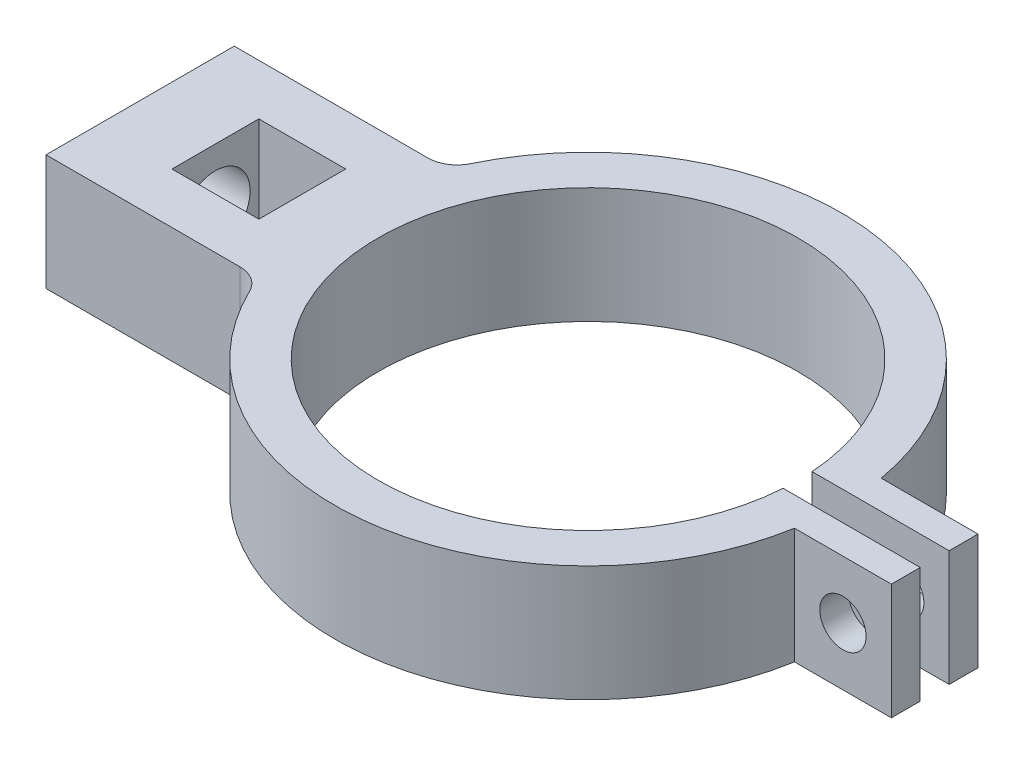
ISO-10303-21;
HEADER;
FILE_DESCRIPTION(('STEP AP214'),'2;1');
FILE_NAME('part.step','',(''),(''),'','','');
FILE_SCHEMA(('AUTOMOTIVE_DESIGN { 1 0 10303 214 1 1 1 1 }'));
ENDSEC;
DATA;
#1=APPLICATION_CONTEXT('core data for automotive mechanical design processes');
#2=APPLICATION_PROTOCOL_DEFINITION('international standard','automotive_design',2000,#1);
#3=PRODUCT_CONTEXT('',#1,'mechanical');
#4=PRODUCT('Part','Part','',(#3));
#5=PRODUCT_RELATED_PRODUCT_CATEGORY('part','',(#4));
#6=PRODUCT_DEFINITION_FORMATION('','',#4);
#7=PRODUCT_DEFINITION_CONTEXT('part definition',#1,'design');
#8=PRODUCT_DEFINITION('design','',#6,#7);
#9=PRODUCT_DEFINITION_SHAPE('','',#8);
#10=(LENGTH_UNIT() NAMED_UNIT(*) SI_UNIT(.MILLI.,.METRE.));
#11=(NAMED_UNIT(*) PLANE_ANGLE_UNIT() SI_UNIT($,.RADIAN.));
#12=(NAMED_UNIT(*) SI_UNIT($,.STERADIAN.) SOLID_ANGLE_UNIT());
#13=UNCERTAINTY_MEASURE_WITH_UNIT(LENGTH_MEASURE(1.E-05),#10,'distance_accuracy_value','');
#14=(GEOMETRIC_REPRESENTATION_CONTEXT(3) GLOBAL_UNCERTAINTY_ASSIGNED_CONTEXT((#13)) GLOBAL_UNIT_ASSIGNED_CONTEXT((#10,
#11,#12)) REPRESENTATION_CONTEXT('',''));
#15=CARTESIAN_POINT('',(0.,0.,0.));
#16=DIRECTION('',(0.,0.,1.));
#17=DIRECTION('',(1.,0.,0.));
#18=AXIS2_PLACEMENT_3D('',#15,#16,#17);
#19=CARTESIAN_POINT('',(0.,10.16,0.));
#20=DIRECTION('',(0.,1.,0.));
#21=DIRECTION('',(0.,0.,1.));
#22=AXIS2_PLACEMENT_3D('',#19,#20,#21);
#23=PLANE('',#22);
#24=DIRECTION('',(1.,0.,0.));
#25=VECTOR('',#24,1.);
#26=CARTESIAN_POINT('',(-20.6350575477753,10.16,8.255));
#27=LINE('',#26,#25);
#28=CARTESIAN_POINT('',(-39.2920360483371,10.16,8.255));
#29=VERTEX_POINT('',#28);
#30=CARTESIAN_POINT('',(-22.288409543976,10.16,8.255));
#31=VERTEX_POINT('',#30);
#32=EDGE_CURVE('E227',#29,#31,#27,.T.);
#33=ORIENTED_EDGE('',*,*,#32,.T.);
#34=CARTESIAN_POINT('',(-22.288409543976,10.16,10.795));
#35=DIRECTION('',(0.,1.,0.));
#36=DIRECTION('',(0.,0.,1.));
#37=AXIS2_PLACEMENT_3D('',#34,#35,#36);
#38=CIRCLE('',#37,2.54);
#39=CARTESIAN_POINT('',(-20.0024188215169,10.16,9.68782051282052));
#40=VERTEX_POINT('',#39);
#41=EDGE_CURVE('E11',#31,#40,#38,.F.);
#42=ORIENTED_EDGE('',*,*,#41,.T.);
#43=CARTESIAN_POINT('',(0.,10.16,0.));
#44=DIRECTION('',(0.,1.,0.));
#45=DIRECTION('',(0.,0.,1.));
#46=AXIS2_PLACEMENT_3D('',#43,#44,#45);
#47=CIRCLE('',#46,22.225);
#48=CARTESIAN_POINT('',(21.8990733162336,10.16,3.79225696521527));
#49=VERTEX_POINT('',#48);
#50=EDGE_CURVE('E203',#40,#49,#47,.T.);
#51=ORIENTED_EDGE('',*,*,#50,.T.);
#52=DIRECTION('',(1.,0.,0.));
#53=VECTOR('',#52,1.);
#54=CARTESIAN_POINT('',(21.8990733162336,10.16,3.79225696521527));
#55=LINE('',#54,#53);
#56=CARTESIAN_POINT('',(30.3942159406479,10.16,3.79225696521527));
#57=VERTEX_POINT('',#56);
#58=EDGE_CURVE('E205',#49,#57,#55,.T.);
#59=ORIENTED_EDGE('',*,*,#58,.T.);
#60=DIRECTION('',(0.000237053910458044,0.,-0.999999971902721));
#61=VECTOR('',#60,1.);
#62=CARTESIAN_POINT('',(30.3948159112672,10.16,1.26131115058317));
#63=LINE('',#62,#61);
#64=CARTESIAN_POINT('',(30.3948159112672,10.16,1.26131115058317));
#65=VERTEX_POINT('',#64);
#66=EDGE_CURVE('E208',#57,#65,#63,.T.);
#67=ORIENTED_EDGE('',*,*,#66,.T.);
#68=DIRECTION('',(-1.,0.,0.));
#69=VECTOR('',#68,1.);
#70=CARTESIAN_POINT('',(30.3948159112672,10.16,1.26131115058317));
#71=LINE('',#70,#69);
#72=CARTESIAN_POINT('',(18.3717532963355,10.16,1.26131115058317));
#73=VERTEX_POINT('',#72);
#74=EDGE_CURVE('E210',#65,#73,#71,.T.);
#75=ORIENTED_EDGE('',*,*,#74,.T.);
#76=CARTESIAN_POINT('',(0.,10.16,0.));
#77=DIRECTION('',(0.,-1.,0.));
#78=DIRECTION('',(0.,0.,1.));
#79=AXIS2_PLACEMENT_3D('',#76,#77,#78);
#80=CIRCLE('',#79,18.415);
#81=CARTESIAN_POINT('',(18.3705520552633,10.16,-1.27868768073392));
#82=VERTEX_POINT('',#81);
#83=EDGE_CURVE('E212',#73,#82,#80,.T.);
#84=ORIENTED_EDGE('',*,*,#83,.T.);
#85=DIRECTION('',(1.,0.,0.));
#86=VECTOR('',#85,1.);
#87=CARTESIAN_POINT('',(30.393614670195,10.16,-1.27868768073392));
#88=LINE('',#87,#86);
#89=CARTESIAN_POINT('',(30.393614670195,10.16,-1.27868768073392));
#90=VERTEX_POINT('',#89);
#91=EDGE_CURVE('E214',#82,#90,#88,.T.);
#92=ORIENTED_EDGE('',*,*,#91,.T.);
#93=DIRECTION('',(-0.000954083026600087,0.,-0.999999544862686));
#94=VECTOR('',#93,1.);
#95=CARTESIAN_POINT('',(30.3911999376842,10.16,-3.80963241455081));
#96=LINE('',#95,#94);
#97=CARTESIAN_POINT('',(30.3911999376842,10.16,-3.80963241455081));
#98=VERTEX_POINT('',#97);
#99=EDGE_CURVE('E216',#90,#98,#96,.T.);
#100=ORIENTED_EDGE('',*,*,#99,.T.);
#101=DIRECTION('',(-1.,0.,0.));
#102=VECTOR('',#101,1.);
#103=CARTESIAN_POINT('',(21.89605731327,10.16,-3.8096324145508));
#104=LINE('',#103,#102);
#105=CARTESIAN_POINT('',(21.89605731327,10.16,-3.80963241455081));
#106=VERTEX_POINT('',#105);
#107=EDGE_CURVE('E218',#98,#106,#104,.T.);
#108=ORIENTED_EDGE('',*,*,#107,.T.);
#109=CARTESIAN_POINT('',(0.,10.16,0.));
#110=DIRECTION('',(0.,1.,0.));
#111=DIRECTION('',(0.,0.,1.));
#112=AXIS2_PLACEMENT_3D('',#109,#110,#111);
#113=CIRCLE('',#112,22.225);
#114=CARTESIAN_POINT('',(-20.0024188215169,10.16,-9.68782051282052));
#115=VERTEX_POINT('',#114);
#116=EDGE_CURVE('E220',#106,#115,#113,.T.);
#117=ORIENTED_EDGE('',*,*,#116,.T.);
#118=CARTESIAN_POINT('',(-22.288409543976,10.16,-10.795));
#119=DIRECTION('',(0.,1.,0.));
#120=DIRECTION('',(0.,0.,1.));
#121=AXIS2_PLACEMENT_3D('',#118,#119,#120);
#122=CIRCLE('',#121,2.54);
#123=CARTESIAN_POINT('',(-22.288409543976,10.16,-8.255));
#124=VERTEX_POINT('',#123);
#125=EDGE_CURVE('E293',#115,#124,#122,.F.);
#126=ORIENTED_EDGE('',*,*,#125,.T.);
#127=DIRECTION('',(-1.,0.,0.));
#128=VECTOR('',#127,1.);
#129=CARTESIAN_POINT('',(-20.6350575477753,10.16,-8.255));
#130=LINE('',#129,#128);
#131=CARTESIAN_POINT('',(-39.2920360483371,10.16,-8.255));
#132=VERTEX_POINT('',#131);
#133=EDGE_CURVE('E223',#124,#132,#130,.T.);
#134=ORIENTED_EDGE('',*,*,#133,.T.);
#135=DIRECTION('',(0.,0.,1.));
#136=VECTOR('',#135,1.);
#137=CARTESIAN_POINT('',(-39.2920360483371,10.16,-8.255));
#138=LINE('',#137,#136);
#139=EDGE_CURVE('E225',#132,#29,#138,.T.);
#140=ORIENTED_EDGE('',*,*,#139,.T.);
#141=EDGE_LOOP('',(#33,#42,#51,#59,#67,#75,#84,#92,#100,#108,#117,#126,#134,#140));
#142=FACE_BOUND('',#141,.T.);
#143=DIRECTION('',(-1.,0.,0.));
#144=VECTOR('',#143,1.);
#145=CARTESIAN_POINT('',(-32.6880360483371,10.16,-3.8096324145508));
#146=LINE('',#145,#144);
#147=CARTESIAN_POINT('',(-25.0680360483371,10.16,-3.8096324145508));
#148=VERTEX_POINT('',#147);
#149=CARTESIAN_POINT('',(-32.6880360483371,10.16,-3.8096324145508));
#150=VERTEX_POINT('',#149);
#151=EDGE_CURVE('E170',#148,#150,#146,.T.);
#152=ORIENTED_EDGE('',*,*,#151,.F.);
#153=DIRECTION('',(0.,0.,-1.));
#154=VECTOR('',#153,1.);
#155=CARTESIAN_POINT('',(-25.0680360483371,10.16,3.81036758544919));
#156=LINE('',#155,#154);
#157=CARTESIAN_POINT('',(-25.0680360483371,10.16,3.81036758544919));
#158=VERTEX_POINT('',#157);
#159=EDGE_CURVE('E160',#158,#148,#156,.T.);
#160=ORIENTED_EDGE('',*,*,#159,.F.);
#161=DIRECTION('',(1.,0.,0.));
#162=VECTOR('',#161,1.);
#163=CARTESIAN_POINT('',(-32.6880360483371,10.16,3.81036758544919));
#164=LINE('',#163,#162);
#165=CARTESIAN_POINT('',(-32.6880360483371,10.16,3.81036758544919));
#166=VERTEX_POINT('',#165);
#167=EDGE_CURVE('E185',#166,#158,#164,.T.);
#168=ORIENTED_EDGE('',*,*,#167,.F.);
#169=DIRECTION('',(0.,0.,1.));
#170=VECTOR('',#169,1.);
#171=CARTESIAN_POINT('',(-32.6880360483371,10.16,3.81036758544919));
#172=LINE('',#171,#170);
#173=EDGE_CURVE('E183',#150,#166,#172,.T.);
#174=ORIENTED_EDGE('',*,*,#173,.F.);
#175=EDGE_LOOP('',(#152,#160,#168,#174));
#176=FACE_BOUND('',#175,.T.);
#177=ADVANCED_FACE('F34',(#142,#176),#23,.T.);
#178=CARTESIAN_POINT('',(0.,0.,0.));
#179=DIRECTION('',(0.,1.,0.));
#180=DIRECTION('',(0.,0.,1.));
#181=AXIS2_PLACEMENT_3D('',#178,#179,#180);
#182=PLANE('',#181);
#183=CARTESIAN_POINT('',(0.,0.,0.));
#184=DIRECTION('',(0.,1.,0.));
#185=DIRECTION('',(0.,0.,1.));
#186=AXIS2_PLACEMENT_3D('',#183,#184,#185);
#187=CIRCLE('',#186,22.225);
#188=CARTESIAN_POINT('',(-20.0024188215169,0.,9.68782051282052));
#189=VERTEX_POINT('',#188);
#190=CARTESIAN_POINT('',(21.8990733162336,0.,3.79225696521527));
#191=VERTEX_POINT('',#190);
#192=EDGE_CURVE('E178',#189,#191,#187,.T.);
#193=ORIENTED_EDGE('',*,*,#192,.F.);
#194=CARTESIAN_POINT('',(-22.288409543976,0.,10.795));
#195=DIRECTION('',(0.,1.,0.));
#196=DIRECTION('',(0.,0.,1.));
#197=AXIS2_PLACEMENT_3D('',#194,#195,#196);
#198=CIRCLE('',#197,2.54);
#199=CARTESIAN_POINT('',(-22.288409543976,0.,8.255));
#200=VERTEX_POINT('',#199);
#201=EDGE_CURVE('E42',#189,#200,#198,.T.);
#202=ORIENTED_EDGE('',*,*,#201,.T.);
#203=DIRECTION('',(1.,0.,0.));
#204=VECTOR('',#203,1.);
#205=CARTESIAN_POINT('',(-20.6350575477753,0.,8.255));
#206=LINE('',#205,#204);
#207=CARTESIAN_POINT('',(-39.2920360483371,0.,8.255));
#208=VERTEX_POINT('',#207);
#209=EDGE_CURVE('E206',#208,#200,#206,.T.);
#210=ORIENTED_EDGE('',*,*,#209,.F.);
#211=DIRECTION('',(0.,0.,1.));
#212=VECTOR('',#211,1.);
#213=CARTESIAN_POINT('',(-39.2920360483371,0.,-8.255));
#214=LINE('',#213,#212);
#215=CARTESIAN_POINT('',(-39.2920360483371,0.,-8.255));
#216=VERTEX_POINT('',#215);
#217=EDGE_CURVE('E250',#216,#208,#214,.T.);
#218=ORIENTED_EDGE('',*,*,#217,.F.);
#219=DIRECTION('',(-1.,0.,0.));
#220=VECTOR('',#219,1.);
#221=CARTESIAN_POINT('',(-20.6350575477753,0.,-8.255));
#222=LINE('',#221,#220);
#223=CARTESIAN_POINT('',(-22.288409543976,0.,-8.255));
#224=VERTEX_POINT('',#223);
#225=EDGE_CURVE('E248',#224,#216,#222,.T.);
#226=ORIENTED_EDGE('',*,*,#225,.F.);
#227=CARTESIAN_POINT('',(-22.288409543976,0.,-10.795));
#228=DIRECTION('',(0.,1.,0.));
#229=DIRECTION('',(0.,0.,1.));
#230=AXIS2_PLACEMENT_3D('',#227,#228,#229);
#231=CIRCLE('',#230,2.54);
#232=CARTESIAN_POINT('',(-20.0024188215169,0.,-9.68782051282052));
#233=VERTEX_POINT('',#232);
#234=EDGE_CURVE('E291',#224,#233,#231,.T.);
#235=ORIENTED_EDGE('',*,*,#234,.T.);
#236=CARTESIAN_POINT('',(0.,0.,0.));
#237=DIRECTION('',(0.,1.,0.));
#238=DIRECTION('',(0.,0.,1.));
#239=AXIS2_PLACEMENT_3D('',#236,#237,#238);
#240=CIRCLE('',#239,22.225);
#241=CARTESIAN_POINT('',(21.89605731327,0.,-3.80963241455081));
#242=VERTEX_POINT('',#241);
#243=EDGE_CURVE('E245',#242,#233,#240,.T.);
#244=ORIENTED_EDGE('',*,*,#243,.F.);
#245=DIRECTION('',(-1.,0.,0.));
#246=VECTOR('',#245,1.);
#247=CARTESIAN_POINT('',(21.89605731327,0.,-3.8096324145508));
#248=LINE('',#247,#246);
#249=CARTESIAN_POINT('',(30.3911999376842,0.,-3.80963241455081));
#250=VERTEX_POINT('',#249);
#251=EDGE_CURVE('E243',#250,#242,#248,.T.);
#252=ORIENTED_EDGE('',*,*,#251,.F.);
#253=DIRECTION('',(-0.000954083026600087,0.,-0.999999544862686));
#254=VECTOR('',#253,1.);
#255=CARTESIAN_POINT('',(30.3911999376842,0.,-3.80963241455081));
#256=LINE('',#255,#254);
#257=CARTESIAN_POINT('',(30.393614670195,0.,-1.27868768073392));
#258=VERTEX_POINT('',#257);
#259=EDGE_CURVE('E241',#258,#250,#256,.T.);
#260=ORIENTED_EDGE('',*,*,#259,.F.);
#261=DIRECTION('',(1.,0.,0.));
#262=VECTOR('',#261,1.);
#263=CARTESIAN_POINT('',(30.393614670195,0.,-1.27868768073392));
#264=LINE('',#263,#262);
#265=CARTESIAN_POINT('',(18.3705520552633,0.,-1.27868768073392));
#266=VERTEX_POINT('',#265);
#267=EDGE_CURVE('E239',#266,#258,#264,.T.);
#268=ORIENTED_EDGE('',*,*,#267,.F.);
#269=CARTESIAN_POINT('',(0.,0.,0.));
#270=DIRECTION('',(0.,-1.,0.));
#271=DIRECTION('',(0.,0.,1.));
#272=AXIS2_PLACEMENT_3D('',#269,#270,#271);
#273=CIRCLE('',#272,18.415);
#274=CARTESIAN_POINT('',(18.3717532963355,0.,1.26131115058317));
#275=VERTEX_POINT('',#274);
#276=EDGE_CURVE('E237',#275,#266,#273,.T.);
#277=ORIENTED_EDGE('',*,*,#276,.F.);
#278=DIRECTION('',(-1.,0.,0.));
#279=VECTOR('',#278,1.);
#280=CARTESIAN_POINT('',(30.3948159112672,0.,1.26131115058317));
#281=LINE('',#280,#279);
#282=CARTESIAN_POINT('',(30.3948159112672,0.,1.26131115058317));
#283=VERTEX_POINT('',#282);
#284=EDGE_CURVE('E235',#283,#275,#281,.T.);
#285=ORIENTED_EDGE('',*,*,#284,.F.);
#286=DIRECTION('',(0.000237053910458044,0.,-0.999999971902721));
#287=VECTOR('',#286,1.);
#288=CARTESIAN_POINT('',(30.3948159112672,0.,1.26131115058317));
#289=LINE('',#288,#287);
#290=CARTESIAN_POINT('',(30.3942159406479,0.,3.79225696521527));
#291=VERTEX_POINT('',#290);
#292=EDGE_CURVE('E233',#291,#283,#289,.T.);
#293=ORIENTED_EDGE('',*,*,#292,.F.);
#294=DIRECTION('',(1.,0.,0.));
#295=VECTOR('',#294,1.);
#296=CARTESIAN_POINT('',(21.8990733162336,0.,3.79225696521527));
#297=LINE('',#296,#295);
#298=EDGE_CURVE('E231',#191,#291,#297,.T.);
#299=ORIENTED_EDGE('',*,*,#298,.F.);
#300=EDGE_LOOP('',(#193,#202,#210,#218,#226,#235,#244,#252,#260,#268,#277,#285,#293,#299));
#301=FACE_BOUND('',#300,.T.);
#302=DIRECTION('',(0.,0.,-1.));
#303=VECTOR('',#302,1.);
#304=CARTESIAN_POINT('',(-25.0680360483371,0.,3.81036758544919));
#305=LINE('',#304,#303);
#306=CARTESIAN_POINT('',(-25.0680360483371,0.,3.81036758544919));
#307=VERTEX_POINT('',#306);
#308=CARTESIAN_POINT('',(-25.0680360483371,0.,-3.8096324145508));
#309=VERTEX_POINT('',#308);
#310=EDGE_CURVE('E190',#307,#309,#305,.T.);
#311=ORIENTED_EDGE('',*,*,#310,.T.);
#312=DIRECTION('',(-1.,0.,0.));
#313=VECTOR('',#312,1.);
#314=CARTESIAN_POINT('',(-32.6880360483371,0.,-3.8096324145508));
#315=LINE('',#314,#313);
#316=CARTESIAN_POINT('',(-32.6880360483371,0.,-3.8096324145508));
#317=VERTEX_POINT('',#316);
#318=EDGE_CURVE('E177',#309,#317,#315,.T.);
#319=ORIENTED_EDGE('',*,*,#318,.T.);
#320=DIRECTION('',(0.,0.,1.));
#321=VECTOR('',#320,1.);
#322=CARTESIAN_POINT('',(-32.6880360483371,0.,3.81036758544919));
#323=LINE('',#322,#321);
#324=CARTESIAN_POINT('',(-32.6880360483371,0.,3.81036758544919));
#325=VERTEX_POINT('',#324);
#326=EDGE_CURVE('E194',#317,#325,#323,.T.);
#327=ORIENTED_EDGE('',*,*,#326,.T.);
#328=DIRECTION('',(1.,0.,0.));
#329=VECTOR('',#328,1.);
#330=CARTESIAN_POINT('',(-32.6880360483371,0.,3.81036758544919));
#331=LINE('',#330,#329);
#332=EDGE_CURVE('E171',#325,#307,#331,.T.);
#333=ORIENTED_EDGE('',*,*,#332,.T.);
#334=EDGE_LOOP('',(#311,#319,#327,#333));
#335=FACE_BOUND('',#334,.T.);
#336=ADVANCED_FACE('F308',(#301,#335),#182,.F.);
#337=CARTESIAN_POINT('',(0.,10.16,0.));
#338=DIRECTION('',(0.,-1.,0.));
#339=DIRECTION('',(0.,0.,-1.));
#340=AXIS2_PLACEMENT_3D('',#337,#338,#339);
#341=CYLINDRICAL_SURFACE('',#340,22.225);
#342=ORIENTED_EDGE('',*,*,#50,.F.);
#343=DIRECTION('',(0.,-1.,0.));
#344=VECTOR('',#343,1.);
#345=CARTESIAN_POINT('',(-20.0024188215169,10.16,9.68782051282052));
#346=LINE('',#345,#344);
#347=EDGE_CURVE('E287',#40,#189,#346,.T.);
#348=ORIENTED_EDGE('',*,*,#347,.T.);
#349=ORIENTED_EDGE('',*,*,#192,.T.);
#350=DIRECTION('',(0.,-1.,0.));
#351=VECTOR('',#350,1.);
#352=CARTESIAN_POINT('',(21.8990733162336,10.16,3.79225696521527));
#353=LINE('',#352,#351);
#354=EDGE_CURVE('E279',#49,#191,#353,.T.);
#355=ORIENTED_EDGE('',*,*,#354,.F.);
#356=EDGE_LOOP('',(#342,#348,#349,#355));
#357=FACE_BOUND('',#356,.T.);
#358=ADVANCED_FACE('F351',(#357),#341,.T.);
#359=CARTESIAN_POINT('',(21.8990733162336,10.16,3.79225696521527));
#360=DIRECTION('',(0.,0.,-1.));
#361=DIRECTION('',(-1.,0.,0.));
#362=AXIS2_PLACEMENT_3D('',#359,#360,#361);
#363=PLANE('',#362);
#364=CARTESIAN_POINT('',(26.1451366269523,5.08,3.79225696521527));
#365=DIRECTION('',(0.,0.,-1.));
#366=DIRECTION('',(-1.,0.,0.));
#367=AXIS2_PLACEMENT_3D('',#364,#365,#366);
#368=CIRCLE('',#367,2.032);
#369=CARTESIAN_POINT('',(24.1131366269523,5.08,3.79225696521527));
#370=VERTEX_POINT('',#369);
#371=EDGE_CURVE('E408',#370,#370,#368,.F.);
#372=ORIENTED_EDGE('',*,*,#371,.F.);
#373=EDGE_LOOP('',(#372));
#374=FACE_BOUND('',#373,.T.);
#375=ORIENTED_EDGE('',*,*,#298,.T.);
#376=DIRECTION('',(0.,-1.,0.));
#377=VECTOR('',#376,1.);
#378=CARTESIAN_POINT('',(30.3942159406479,10.16,3.79225696521527));
#379=LINE('',#378,#377);
#380=EDGE_CURVE('E276',#57,#291,#379,.T.);
#381=ORIENTED_EDGE('',*,*,#380,.F.);
#382=ORIENTED_EDGE('',*,*,#58,.F.);
#383=ORIENTED_EDGE('',*,*,#354,.T.);
#384=EDGE_LOOP('',(#375,#381,#382,#383));
#385=FACE_BOUND('',#384,.T.);
#386=ADVANCED_FACE('F347',(#374,#385),#363,.F.);
#387=CARTESIAN_POINT('',(30.3948159112672,10.16,1.26131115058317));
#388=DIRECTION('',(-0.999999971902721,0.,-0.000237053910458044));
#389=DIRECTION('',(-0.000237053910458044,0.,0.999999971902721));
#390=AXIS2_PLACEMENT_3D('',#387,#388,#389);
#391=PLANE('',#390);
#392=ORIENTED_EDGE('',*,*,#292,.T.);
#393=DIRECTION('',(0.,-1.,0.));
#394=VECTOR('',#393,1.);
#395=CARTESIAN_POINT('',(30.3948159112672,10.16,1.26131115058317));
#396=LINE('',#395,#394);
#397=EDGE_CURVE('E273',#65,#283,#396,.T.);
#398=ORIENTED_EDGE('',*,*,#397,.F.);
#399=ORIENTED_EDGE('',*,*,#66,.F.);
#400=ORIENTED_EDGE('',*,*,#380,.T.);
#401=EDGE_LOOP('',(#392,#398,#399,#400));
#402=FACE_BOUND('',#401,.T.);
#403=ADVANCED_FACE('F343',(#402),#391,.F.);
#404=CARTESIAN_POINT('',(30.3948159112672,10.16,1.26131115058317));
#405=DIRECTION('',(0.,0.,1.));
#406=DIRECTION('',(1.,0.,0.));
#407=AXIS2_PLACEMENT_3D('',#404,#405,#406);
#408=PLANE('',#407);
#409=CARTESIAN_POINT('',(26.1451366269523,5.08,1.26131115058317));
#410=DIRECTION('',(0.,0.,1.));
#411=DIRECTION('',(1.,0.,0.));
#412=AXIS2_PLACEMENT_3D('',#409,#410,#411);
#413=CIRCLE('',#412,2.032);
#414=CARTESIAN_POINT('',(28.1771366269523,5.08,1.26131115058317));
#415=VERTEX_POINT('',#414);
#416=EDGE_CURVE('E192',#415,#415,#413,.T.);
#417=ORIENTED_EDGE('',*,*,#416,.T.);
#418=EDGE_LOOP('',(#417));
#419=FACE_BOUND('',#418,.T.);
#420=ORIENTED_EDGE('',*,*,#284,.T.);
#421=DIRECTION('',(0.,-1.,0.));
#422=VECTOR('',#421,1.);
#423=CARTESIAN_POINT('',(18.3717532963355,10.16,1.26131115058317));
#424=LINE('',#423,#422);
#425=EDGE_CURVE('E270',#73,#275,#424,.T.);
#426=ORIENTED_EDGE('',*,*,#425,.F.);
#427=ORIENTED_EDGE('',*,*,#74,.F.);
#428=ORIENTED_EDGE('',*,*,#397,.T.);
#429=EDGE_LOOP('',(#420,#426,#427,#428));
#430=FACE_BOUND('',#429,.T.);
#431=ADVANCED_FACE('F338',(#419,#430),#408,.F.);
#432=CARTESIAN_POINT('',(0.,10.16,0.));
#433=DIRECTION('',(0.,-1.,0.));
#434=DIRECTION('',(0.,0.,-1.));
#435=AXIS2_PLACEMENT_3D('',#432,#433,#434);
#436=CYLINDRICAL_SURFACE('',#435,18.415);
#437=ORIENTED_EDGE('',*,*,#276,.T.);
#438=DIRECTION('',(0.,-1.,0.));
#439=VECTOR('',#438,1.);
#440=CARTESIAN_POINT('',(18.3705520552633,10.16,-1.27868768073392));
#441=LINE('',#440,#439);
#442=EDGE_CURVE('E267',#82,#266,#441,.T.);
#443=ORIENTED_EDGE('',*,*,#442,.F.);
#444=ORIENTED_EDGE('',*,*,#83,.F.);
#445=ORIENTED_EDGE('',*,*,#425,.T.);
#446=EDGE_LOOP('',(#437,#443,#444,#445));
#447=FACE_BOUND('',#446,.T.);
#448=ADVANCED_FACE('F332',(#447),#436,.F.);
#449=CARTESIAN_POINT('',(30.393614670195,10.16,-1.27868768073392));
#450=DIRECTION('',(0.,0.,-1.));
#451=DIRECTION('',(-1.,0.,0.));
#452=AXIS2_PLACEMENT_3D('',#449,#450,#451);
#453=PLANE('',#452);
#454=CARTESIAN_POINT('',(26.1451366269523,5.08,-1.27868768073392));
#455=DIRECTION('',(0.,0.,-1.));
#456=DIRECTION('',(-1.,0.,0.));
#457=AXIS2_PLACEMENT_3D('',#454,#455,#456);
#458=CIRCLE('',#457,2.032);
#459=CARTESIAN_POINT('',(24.1131366269523,5.08,-1.27868768073392));
#460=VERTEX_POINT('',#459);
#461=EDGE_CURVE('E414',#460,#460,#458,.T.);
#462=ORIENTED_EDGE('',*,*,#461,.T.);
#463=EDGE_LOOP('',(#462));
#464=FACE_BOUND('',#463,.T.);
#465=ORIENTED_EDGE('',*,*,#267,.T.);
#466=DIRECTION('',(0.,-1.,0.));
#467=VECTOR('',#466,1.);
#468=CARTESIAN_POINT('',(30.393614670195,10.16,-1.27868768073392));
#469=LINE('',#468,#467);
#470=EDGE_CURVE('E264',#90,#258,#469,.T.);
#471=ORIENTED_EDGE('',*,*,#470,.F.);
#472=ORIENTED_EDGE('',*,*,#91,.F.);
#473=ORIENTED_EDGE('',*,*,#442,.T.);
#474=EDGE_LOOP('',(#465,#471,#472,#473));
#475=FACE_BOUND('',#474,.T.);
#476=ADVANCED_FACE('F328',(#464,#475),#453,.F.);
#477=CARTESIAN_POINT('',(30.3911999376842,10.16,-3.80963241455081));
#478=DIRECTION('',(-0.999999544862686,0.,0.000954083026600087));
#479=DIRECTION('',(0.000954083026600087,0.,0.999999544862686));
#480=AXIS2_PLACEMENT_3D('',#477,#478,#479);
#481=PLANE('',#480);
#482=ORIENTED_EDGE('',*,*,#259,.T.);
#483=DIRECTION('',(0.,-1.,0.));
#484=VECTOR('',#483,1.);
#485=CARTESIAN_POINT('',(30.3911999376842,10.16,-3.80963241455081));
#486=LINE('',#485,#484);
#487=EDGE_CURVE('E261',#98,#250,#486,.T.);
#488=ORIENTED_EDGE('',*,*,#487,.F.);
#489=ORIENTED_EDGE('',*,*,#99,.F.);
#490=ORIENTED_EDGE('',*,*,#470,.T.);
#491=EDGE_LOOP('',(#482,#488,#489,#490));
#492=FACE_BOUND('',#491,.T.);
#493=ADVANCED_FACE('F323',(#492),#481,.F.);
#494=CARTESIAN_POINT('',(21.89605731327,10.16,-3.8096324145508));
#495=DIRECTION('',(0.,0.,1.));
#496=DIRECTION('',(1.,0.,0.));
#497=AXIS2_PLACEMENT_3D('',#494,#495,#496);
#498=PLANE('',#497);
#499=CARTESIAN_POINT('',(26.1451366269523,5.08,-3.8096324145508));
#500=DIRECTION('',(0.,0.,-1.));
#501=DIRECTION('',(-1.,0.,0.));
#502=AXIS2_PLACEMENT_3D('',#499,#500,#501);
#503=CIRCLE('',#502,2.032);
#504=CARTESIAN_POINT('',(24.1131366269523,5.08,-3.8096324145508));
#505=VERTEX_POINT('',#504);
#506=EDGE_CURVE('E405',#505,#505,#503,.T.);
#507=ORIENTED_EDGE('',*,*,#506,.F.);
#508=EDGE_LOOP('',(#507));
#509=FACE_BOUND('',#508,.T.);
#510=ORIENTED_EDGE('',*,*,#251,.T.);
#511=DIRECTION('',(0.,-1.,0.));
#512=VECTOR('',#511,1.);
#513=CARTESIAN_POINT('',(21.89605731327,10.16,-3.80963241455081));
#514=LINE('',#513,#512);
#515=EDGE_CURVE('E258',#106,#242,#514,.T.);
#516=ORIENTED_EDGE('',*,*,#515,.F.);
#517=ORIENTED_EDGE('',*,*,#107,.F.);
#518=ORIENTED_EDGE('',*,*,#487,.T.);
#519=EDGE_LOOP('',(#510,#516,#517,#518));
#520=FACE_BOUND('',#519,.T.);
#521=ADVANCED_FACE('F317',(#509,#520),#498,.F.);
#522=CARTESIAN_POINT('',(0.,10.16,0.));
#523=DIRECTION('',(0.,-1.,0.));
#524=DIRECTION('',(0.,0.,-1.));
#525=AXIS2_PLACEMENT_3D('',#522,#523,#524);
#526=CYLINDRICAL_SURFACE('',#525,22.225);
#527=ORIENTED_EDGE('',*,*,#243,.T.);
#528=DIRECTION('',(0.,-1.,0.));
#529=VECTOR('',#528,1.);
#530=CARTESIAN_POINT('',(-20.0024188215169,10.16,-9.68782051282052));
#531=LINE('',#530,#529);
#532=EDGE_CURVE('E285',#233,#115,#531,.F.);
#533=ORIENTED_EDGE('',*,*,#532,.T.);
#534=ORIENTED_EDGE('',*,*,#116,.F.);
#535=ORIENTED_EDGE('',*,*,#515,.T.);
#536=EDGE_LOOP('',(#527,#533,#534,#535));
#537=FACE_BOUND('',#536,.T.);
#538=ADVANCED_FACE('F313',(#537),#526,.T.);
#539=CARTESIAN_POINT('',(-20.6350575477753,10.16,-8.255));
#540=DIRECTION('',(0.,0.,1.));
#541=DIRECTION('',(1.,0.,0.));
#542=AXIS2_PLACEMENT_3D('',#539,#540,#541);
#543=PLANE('',#542);
#544=ORIENTED_EDGE('',*,*,#133,.F.);
#545=DIRECTION('',(0.,1.,0.));
#546=VECTOR('',#545,1.);
#547=CARTESIAN_POINT('',(-22.288409543976,0.,-8.255));
#548=LINE('',#547,#546);
#549=EDGE_CURVE('E282',#124,#224,#548,.F.);
#550=ORIENTED_EDGE('',*,*,#549,.T.);
#551=ORIENTED_EDGE('',*,*,#225,.T.);
#552=DIRECTION('',(0.,-1.,0.));
#553=VECTOR('',#552,1.);
#554=CARTESIAN_POINT('',(-39.2920360483371,10.16,-8.255));
#555=LINE('',#554,#553);
#556=EDGE_CURVE('E255',#132,#216,#555,.T.);
#557=ORIENTED_EDGE('',*,*,#556,.F.);
#558=EDGE_LOOP('',(#544,#550,#551,#557));
#559=FACE_BOUND('',#558,.T.);
#560=ADVANCED_FACE('F303',(#559),#543,.F.);
#561=CARTESIAN_POINT('',(-39.2920360483371,10.16,-8.255));
#562=DIRECTION('',(1.,0.,0.));
#563=DIRECTION('',(0.,0.,-1.));
#564=AXIS2_PLACEMENT_3D('',#561,#562,#563);
#565=PLANE('',#564);
#566=CARTESIAN_POINT('',(-39.2920360483371,5.08,0.));
#567=DIRECTION('',(-1.,0.,0.));
#568=DIRECTION('',(0.,0.,1.));
#569=AXIS2_PLACEMENT_3D('',#566,#567,#568);
#570=CIRCLE('',#569,3.048);
#571=CARTESIAN_POINT('',(-39.2920360483371,5.08,3.048));
#572=VERTEX_POINT('',#571);
#573=EDGE_CURVE('E401',#572,#572,#570,.T.);
#574=ORIENTED_EDGE('',*,*,#573,.F.);
#575=EDGE_LOOP('',(#574));
#576=FACE_BOUND('',#575,.T.);
#577=ORIENTED_EDGE('',*,*,#217,.T.);
#578=DIRECTION('',(0.,-1.,0.));
#579=VECTOR('',#578,1.);
#580=CARTESIAN_POINT('',(-39.2920360483371,10.16,8.255));
#581=LINE('',#580,#579);
#582=EDGE_CURVE('E229',#29,#208,#581,.T.);
#583=ORIENTED_EDGE('',*,*,#582,.F.);
#584=ORIENTED_EDGE('',*,*,#139,.F.);
#585=ORIENTED_EDGE('',*,*,#556,.T.);
#586=EDGE_LOOP('',(#577,#583,#584,#585));
#587=FACE_BOUND('',#586,.T.);
#588=ADVANCED_FACE('F358',(#576,#587),#565,.F.);
#589=CARTESIAN_POINT('',(-20.6350575477753,10.16,8.255));
#590=DIRECTION('',(0.,0.,-1.));
#591=DIRECTION('',(-1.,0.,0.));
#592=AXIS2_PLACEMENT_3D('',#589,#590,#591);
#593=PLANE('',#592);
#594=ORIENTED_EDGE('',*,*,#209,.T.);
#595=DIRECTION('',(0.,1.,0.));
#596=VECTOR('',#595,1.);
#597=CARTESIAN_POINT('',(-22.288409543976,10.16,8.255));
#598=LINE('',#597,#596);
#599=EDGE_CURVE('E49',#200,#31,#598,.T.);
#600=ORIENTED_EDGE('',*,*,#599,.T.);
#601=ORIENTED_EDGE('',*,*,#32,.F.);
#602=ORIENTED_EDGE('',*,*,#582,.T.);
#603=EDGE_LOOP('',(#594,#600,#601,#602));
#604=FACE_BOUND('',#603,.T.);
#605=ADVANCED_FACE('F356',(#604),#593,.F.);
#606=CARTESIAN_POINT('',(-25.0680360483371,10.16,3.81036758544919));
#607=DIRECTION('',(-1.,0.,0.));
#608=DIRECTION('',(0.,0.,1.));
#609=AXIS2_PLACEMENT_3D('',#606,#607,#608);
#610=PLANE('',#609);
#611=ORIENTED_EDGE('',*,*,#310,.F.);
#612=DIRECTION('',(0.,-1.,0.));
#613=VECTOR('',#612,1.);
#614=CARTESIAN_POINT('',(-25.0680360483371,10.16,3.81036758544919));
#615=LINE('',#614,#613);
#616=EDGE_CURVE('E166',#158,#307,#615,.T.);
#617=ORIENTED_EDGE('',*,*,#616,.F.);
#618=ORIENTED_EDGE('',*,*,#159,.T.);
#619=DIRECTION('',(0.,-1.,0.));
#620=VECTOR('',#619,1.);
#621=CARTESIAN_POINT('',(-25.0680360483371,10.16,-3.8096324145508));
#622=LINE('',#621,#620);
#623=EDGE_CURVE('E163',#148,#309,#622,.T.);
#624=ORIENTED_EDGE('',*,*,#623,.T.);
#625=EDGE_LOOP('',(#611,#617,#618,#624));
#626=FACE_BOUND('',#625,.T.);
#627=ADVANCED_FACE('F162',(#626),#610,.T.);
#628=CARTESIAN_POINT('',(-32.6880360483371,10.16,-3.8096324145508));
#629=DIRECTION('',(0.,0.,1.));
#630=DIRECTION('',(1.,0.,0.));
#631=AXIS2_PLACEMENT_3D('',#628,#629,#630);
#632=PLANE('',#631);
#633=ORIENTED_EDGE('',*,*,#318,.F.);
#634=ORIENTED_EDGE('',*,*,#623,.F.);
#635=ORIENTED_EDGE('',*,*,#151,.T.);
#636=DIRECTION('',(0.,-1.,0.));
#637=VECTOR('',#636,1.);
#638=CARTESIAN_POINT('',(-32.6880360483371,10.16,-3.8096324145508));
#639=LINE('',#638,#637);
#640=EDGE_CURVE('E179',#150,#317,#639,.T.);
#641=ORIENTED_EDGE('',*,*,#640,.T.);
#642=EDGE_LOOP('',(#633,#634,#635,#641));
#643=FACE_BOUND('',#642,.T.);
#644=ADVANCED_FACE('F174',(#643),#632,.T.);
#645=CARTESIAN_POINT('',(-32.6880360483371,10.16,3.81036758544919));
#646=DIRECTION('',(1.,0.,0.));
#647=DIRECTION('',(0.,0.,-1.));
#648=AXIS2_PLACEMENT_3D('',#645,#646,#647);
#649=PLANE('',#648);
#650=CARTESIAN_POINT('',(-32.6880360483371,5.08,0.));
#651=DIRECTION('',(1.,0.,0.));
#652=DIRECTION('',(0.,0.,-1.));
#653=AXIS2_PLACEMENT_3D('',#650,#651,#652);
#654=CIRCLE('',#653,3.048);
#655=CARTESIAN_POINT('',(-32.6880360483371,5.08,3.048));
#656=VERTEX_POINT('',#655);
#657=EDGE_CURVE('E404',#656,#656,#654,.F.);
#658=ORIENTED_EDGE('',*,*,#657,.T.);
#659=EDGE_LOOP('',(#658));
#660=FACE_BOUND('',#659,.T.);
#661=ORIENTED_EDGE('',*,*,#326,.F.);
#662=ORIENTED_EDGE('',*,*,#640,.F.);
#663=ORIENTED_EDGE('',*,*,#173,.T.);
#664=DIRECTION('',(0.,-1.,0.));
#665=VECTOR('',#664,1.);
#666=CARTESIAN_POINT('',(-32.6880360483371,10.16,3.81036758544919));
#667=LINE('',#666,#665);
#668=EDGE_CURVE('E200',#166,#325,#667,.T.);
#669=ORIENTED_EDGE('',*,*,#668,.T.);
#670=EDGE_LOOP('',(#661,#662,#663,#669));
#671=FACE_BOUND('',#670,.T.);
#672=ADVANCED_FACE('F380',(#660,#671),#649,.T.);
#673=CARTESIAN_POINT('',(-32.6880360483371,10.16,3.81036758544919));
#674=DIRECTION('',(0.,0.,-1.));
#675=DIRECTION('',(-1.,0.,0.));
#676=AXIS2_PLACEMENT_3D('',#673,#674,#675);
#677=PLANE('',#676);
#678=ORIENTED_EDGE('',*,*,#332,.F.);
#679=ORIENTED_EDGE('',*,*,#668,.F.);
#680=ORIENTED_EDGE('',*,*,#167,.T.);
#681=ORIENTED_EDGE('',*,*,#616,.T.);
#682=EDGE_LOOP('',(#678,#679,#680,#681));
#683=FACE_BOUND('',#682,.T.);
#684=ADVANCED_FACE('F383',(#683),#677,.T.);
#685=CARTESIAN_POINT('',(26.1451366269523,5.08,9.53962088269953));
#686=DIRECTION('',(0.,0.,-1.));
#687=DIRECTION('',(-1.,0.,0.));
#688=AXIS2_PLACEMENT_3D('',#685,#686,#687);
#689=CYLINDRICAL_SURFACE('',#688,2.032);
#690=ORIENTED_EDGE('',*,*,#506,.T.);
#691=EDGE_LOOP('',(#690));
#692=FACE_BOUND('',#691,.T.);
#693=ORIENTED_EDGE('',*,*,#461,.F.);
#694=EDGE_LOOP('',(#693));
#695=FACE_BOUND('',#694,.T.);
#696=ADVANCED_FACE('F387',(#692,#695),#689,.F.);
#697=ORIENTED_EDGE('',*,*,#371,.T.);
#698=EDGE_LOOP('',(#697));
#699=FACE_BOUND('',#698,.T.);
#700=ORIENTED_EDGE('',*,*,#416,.F.);
#701=EDGE_LOOP('',(#700));
#702=FACE_BOUND('',#701,.T.);
#703=ADVANCED_FACE('F389',(#699,#702),#689,.F.);
#704=CARTESIAN_POINT('',(-24.0669901721107,5.08,0.));
#705=DIRECTION('',(-1.,0.,0.));
#706=DIRECTION('',(0.,0.,1.));
#707=AXIS2_PLACEMENT_3D('',#704,#705,#706);
#708=CYLINDRICAL_SURFACE('',#707,3.048);
#709=CARTESIAN_POINT('',(-39.2920360483371,5.08,3.048));
#710=CARTESIAN_POINT('',(-39.2232443816704,5.08,3.048));
#711=CARTESIAN_POINT('',(-39.1544527150038,5.08,3.048));
#712=CARTESIAN_POINT('',(-39.0168693816704,5.08,3.048));
#713=CARTESIAN_POINT('',(-38.9480777150038,5.08,3.048));
#714=CARTESIAN_POINT('',(-38.8104943816704,5.08,3.048));
#715=CARTESIAN_POINT('',(-38.7417027150038,5.08,3.048));
#716=CARTESIAN_POINT('',(-38.6041193816704,5.08,3.048));
#717=CARTESIAN_POINT('',(-38.5353277150038,5.08,3.048));
#718=CARTESIAN_POINT('',(-38.3977443816704,5.08,3.048));
#719=CARTESIAN_POINT('',(-38.3289527150038,5.08,3.048));
#720=CARTESIAN_POINT('',(-38.1913693816704,5.08,3.048));
#721=CARTESIAN_POINT('',(-38.1225777150038,5.08,3.048));
#722=CARTESIAN_POINT('',(-37.9849943816704,5.08,3.048));
#723=CARTESIAN_POINT('',(-37.9162027150038,5.08,3.048));
#724=CARTESIAN_POINT('',(-37.7786193816704,5.08,3.048));
#725=CARTESIAN_POINT('',(-37.7098277150038,5.08,3.048));
#726=CARTESIAN_POINT('',(-37.5722443816704,5.08,3.048));
#727=CARTESIAN_POINT('',(-37.5034527150038,5.08,3.048));
#728=CARTESIAN_POINT('',(-37.3658693816704,5.08,3.048));
#729=CARTESIAN_POINT('',(-37.2970777150038,5.08,3.048));
#730=CARTESIAN_POINT('',(-37.1594943816704,5.08,3.048));
#731=CARTESIAN_POINT('',(-37.0907027150038,5.08,3.048));
#732=CARTESIAN_POINT('',(-36.9531193816704,5.08,3.048));
#733=CARTESIAN_POINT('',(-36.8843277150038,5.08,3.048));
#734=CARTESIAN_POINT('',(-36.7467443816704,5.08,3.048));
#735=CARTESIAN_POINT('',(-36.6779527150038,5.08,3.048));
#736=CARTESIAN_POINT('',(-36.5403693816704,5.08,3.048));
#737=CARTESIAN_POINT('',(-36.4715777150038,5.08,3.048));
#738=CARTESIAN_POINT('',(-36.3339943816704,5.08,3.048));
#739=CARTESIAN_POINT('',(-36.2652027150038,5.08,3.048));
#740=CARTESIAN_POINT('',(-36.1276193816704,5.08,3.048));
#741=CARTESIAN_POINT('',(-36.0588277150038,5.08,3.048));
#742=CARTESIAN_POINT('',(-35.9212443816704,5.08,3.048));
#743=CARTESIAN_POINT('',(-35.8524527150038,5.08,3.048));
#744=CARTESIAN_POINT('',(-35.7148693816704,5.08,3.048));
#745=CARTESIAN_POINT('',(-35.6460777150038,5.08,3.048));
#746=CARTESIAN_POINT('',(-35.5084943816704,5.08,3.048));
#747=CARTESIAN_POINT('',(-35.4397027150038,5.08,3.048));
#748=CARTESIAN_POINT('',(-35.3021193816704,5.08,3.048));
#749=CARTESIAN_POINT('',(-35.2333277150038,5.08,3.048));
#750=CARTESIAN_POINT('',(-35.0957443816704,5.08,3.048));
#751=CARTESIAN_POINT('',(-35.0269527150038,5.08,3.048));
#752=CARTESIAN_POINT('',(-34.8893693816704,5.08,3.048));
#753=CARTESIAN_POINT('',(-34.8205777150038,5.08,3.048));
#754=CARTESIAN_POINT('',(-34.6829943816704,5.08,3.048));
#755=CARTESIAN_POINT('',(-34.6142027150038,5.08,3.048));
#756=CARTESIAN_POINT('',(-34.4766193816704,5.08,3.048));
#757=CARTESIAN_POINT('',(-34.4078277150038,5.08,3.048));
#758=CARTESIAN_POINT('',(-34.2702443816704,5.08,3.048));
#759=CARTESIAN_POINT('',(-34.2014527150038,5.08,3.048));
#760=CARTESIAN_POINT('',(-34.0638693816704,5.08,3.048));
#761=CARTESIAN_POINT('',(-33.9950777150038,5.08,3.048));
#762=CARTESIAN_POINT('',(-33.8574943816704,5.08,3.048));
#763=CARTESIAN_POINT('',(-33.7887027150038,5.08,3.048));
#764=CARTESIAN_POINT('',(-33.6511193816704,5.08,3.048));
#765=CARTESIAN_POINT('',(-33.5823277150038,5.08,3.048));
#766=CARTESIAN_POINT('',(-33.4447443816704,5.08,3.048));
#767=CARTESIAN_POINT('',(-33.3759527150038,5.08,3.048));
#768=CARTESIAN_POINT('',(-33.2383693816704,5.08,3.048));
#769=CARTESIAN_POINT('',(-33.1695777150038,5.08,3.048));
#770=CARTESIAN_POINT('',(-33.0319943816704,5.08,3.048));
#771=CARTESIAN_POINT('',(-32.9632027150038,5.08,3.048));
#772=CARTESIAN_POINT('',(-32.8256193816704,5.08,3.048));
#773=CARTESIAN_POINT('',(-32.7568277150038,5.08,3.048));
#774=CARTESIAN_POINT('',(-32.6880360483371,5.08,3.048));
#775=B_SPLINE_CURVE_WITH_KNOTS('',3,(#709,#710,#711,#712,#713,#714,#715,#716,#717,#718,#719,
#720,#721,#722,#723,#724,#725,#726,#727,#728,#729,#730,#731,#732,#733,#734,#735,#736,#737,#738,
#739,#740,#741,#742,#743,#744,#745,#746,#747,#748,#749,#750,#751,#752,#753,#754,#755,#756,#757,
#758,#759,#760,#761,#762,#763,#764,#765,#766,#767,#768,#769,#770,#771,#772,#773,#774),
.UNSPECIFIED.,.F.,.F.,(4,2,2,2,2,2,2,2,2,2,2,2,2,2,2,2,2,2,2,2,2,2,2,2,2,2,2,2,2,2,2,2,4),(0.,
0.206375000000002,0.412749999999996,0.619124999999998,0.8255,1.03187499999999,1.23825,1.444625,
1.65099999999999,1.85737499999999,2.06375,2.27012499999999,2.47649999999999,2.68287499999999,
2.88925,3.09562499999999,3.30199999999999,3.50837499999999,3.71474999999999,3.92112499999999,
4.12749999999999,4.33387499999999,4.54024999999999,4.74662499999999,4.95299999999999,
5.15937499999999,5.36574999999999,5.57212499999999,5.77849999999999,5.98487499999999,
6.19124999999999,6.39762499999998,6.60399999999998),.UNSPECIFIED.);
#776=EDGE_CURVE('BSEAM392',#572,#656,#775,.T.);
#777=ORIENTED_EDGE('',*,*,#573,.T.);
#778=ORIENTED_EDGE('',*,*,#657,.F.);
#779=ORIENTED_EDGE('',*,*,#776,.T.);
#780=ORIENTED_EDGE('',*,*,#776,.F.);
#781=EDGE_LOOP('',(#777,#779,#778,#780));
#782=FACE_BOUND('',#781,.T.);
#783=ADVANCED_FACE('F392',(#782),#708,.F.);
#784=CARTESIAN_POINT('',(-22.288409543976,10.16,-10.795));
#785=DIRECTION('',(0.,-1.,0.));
#786=DIRECTION('',(0.,0.,-1.));
#787=AXIS2_PLACEMENT_3D('',#784,#785,#786);
#788=CYLINDRICAL_SURFACE('',#787,2.54);
#789=ORIENTED_EDGE('',*,*,#125,.F.);
#790=ORIENTED_EDGE('',*,*,#532,.F.);
#791=ORIENTED_EDGE('',*,*,#234,.F.);
#792=ORIENTED_EDGE('',*,*,#549,.F.);
#793=EDGE_LOOP('',(#789,#790,#791,#792));
#794=FACE_BOUND('',#793,.T.);
#795=ADVANCED_FACE('F306',(#794),#788,.F.);
#796=CARTESIAN_POINT('',(-22.288409543976,10.16,10.795));
#797=DIRECTION('',(0.,-1.,0.));
#798=DIRECTION('',(0.,0.,-1.));
#799=AXIS2_PLACEMENT_3D('',#796,#797,#798);
#800=CYLINDRICAL_SURFACE('',#799,2.54);
#801=ORIENTED_EDGE('',*,*,#41,.F.);
#802=ORIENTED_EDGE('',*,*,#599,.F.);
#803=ORIENTED_EDGE('',*,*,#201,.F.);
#804=ORIENTED_EDGE('',*,*,#347,.F.);
#805=EDGE_LOOP('',(#801,#802,#803,#804));
#806=FACE_BOUND('',#805,.T.);
#807=ADVANCED_FACE('F36',(#806),#800,.F.);
#808=CLOSED_SHELL('',(#177,#336,#358,#386,#403,#431,#448,#476,#493,#521,#538,#560,#588,#605,
#627,#644,#672,#684,#696,#703,#783,#795,#807));
#809=MANIFOLD_SOLID_BREP('B2',#808);
#810=ADVANCED_BREP_SHAPE_REPRESENTATION('',(#18,#809),#14);
#811=SHAPE_DEFINITION_REPRESENTATION(#9,#810);
ENDSEC;
END-ISO-10303-21;
